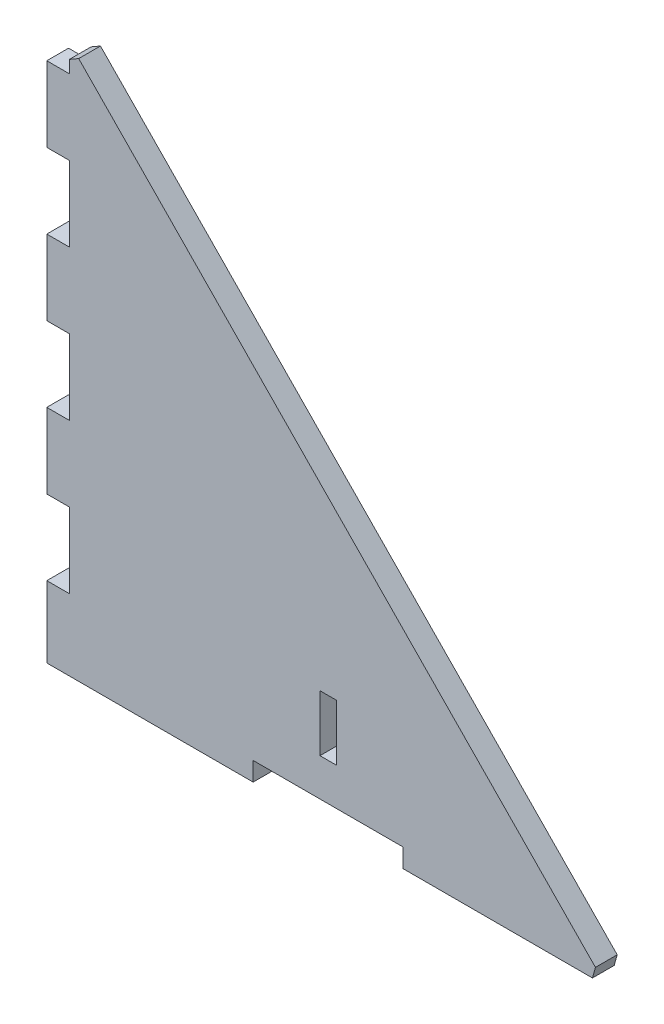
ISO-10303-21;
HEADER;
FILE_DESCRIPTION(('STEP AP214'),'2;1');
FILE_NAME('part.step','',(''),(''),'','','');
FILE_SCHEMA(('AUTOMOTIVE_DESIGN { 1 0 10303 214 1 1 1 1 }'));
ENDSEC;
DATA;
#1=APPLICATION_CONTEXT('core data for automotive mechanical design processes');
#2=APPLICATION_PROTOCOL_DEFINITION('international standard','automotive_design',2000,#1);
#3=PRODUCT_CONTEXT('',#1,'mechanical');
#4=PRODUCT('Part','Part','',(#3));
#5=PRODUCT_RELATED_PRODUCT_CATEGORY('part','',(#4));
#6=PRODUCT_DEFINITION_FORMATION('','',#4);
#7=PRODUCT_DEFINITION_CONTEXT('part definition',#1,'design');
#8=PRODUCT_DEFINITION('design','',#6,#7);
#9=PRODUCT_DEFINITION_SHAPE('','',#8);
#10=(LENGTH_UNIT() NAMED_UNIT(*) SI_UNIT(.MILLI.,.METRE.));
#11=(NAMED_UNIT(*) PLANE_ANGLE_UNIT() SI_UNIT($,.RADIAN.));
#12=(NAMED_UNIT(*) SI_UNIT($,.STERADIAN.) SOLID_ANGLE_UNIT());
#13=UNCERTAINTY_MEASURE_WITH_UNIT(LENGTH_MEASURE(1.E-05),#10,'distance_accuracy_value','');
#14=(GEOMETRIC_REPRESENTATION_CONTEXT(3) GLOBAL_UNCERTAINTY_ASSIGNED_CONTEXT((#13)) GLOBAL_UNIT_ASSIGNED_CONTEXT((#10,
#11,#12)) REPRESENTATION_CONTEXT('',''));
#15=CARTESIAN_POINT('',(0.,0.,0.));
#16=DIRECTION('',(0.,0.,1.));
#17=DIRECTION('',(1.,0.,0.));
#18=AXIS2_PLACEMENT_3D('',#15,#16,#17);
#19=CARTESIAN_POINT('',(0.,0.,144.490770958943));
#20=DIRECTION('',(0.,0.,-1.));
#21=DIRECTION('',(-1.,0.,0.));
#22=AXIS2_PLACEMENT_3D('',#19,#20,#21);
#23=PLANE('',#22);
#24=DIRECTION('',(0.,1.,0.));
#25=VECTOR('',#24,1.);
#26=CARTESIAN_POINT('',(5.99999999999914,69.9999999999999,144.490770958943));
#27=LINE('',#26,#25);
#28=CARTESIAN_POINT('',(5.99999999999914,69.9999999999999,144.490770958943));
#29=VERTEX_POINT('',#28);
#30=CARTESIAN_POINT('',(5.9999999999992,71.6541279702322,144.490770958943));
#31=VERTEX_POINT('',#30);
#32=EDGE_CURVE('E299',#29,#31,#27,.T.);
#33=ORIENTED_EDGE('',*,*,#32,.T.);
#34=DIRECTION('',(-0.866025403784458,-0.499999999999966,0.));
#35=VECTOR('',#34,1.);
#36=CARTESIAN_POINT('',(-29.5271475541201,51.1425197663237,144.490770958943));
#37=LINE('',#36,#35);
#38=CARTESIAN_POINT('',(7.24974671635039,72.3756695733363,144.490770958943));
#39=VERTEX_POINT('',#38);
#40=EDGE_CURVE('E47',#31,#39,#37,.F.);
#41=ORIENTED_EDGE('',*,*,#40,.T.);
#42=DIRECTION('',(0.699031413700107,-0.715090961109445,0.));
#43=VECTOR('',#42,1.);
#44=CARTESIAN_POINT('',(5.99999999999929,73.6541279702322,144.490770958943));
#45=LINE('',#44,#43);
#46=CARTESIAN_POINT('',(76.1131661967949,1.93018192221889,144.490770958943));
#47=VERTEX_POINT('',#46);
#48=EDGE_CURVE('E301',#39,#47,#45,.T.);
#49=ORIENTED_EDGE('',*,*,#48,.T.);
#50=DIRECTION('',(0.269771231487344,0.962924442862368,0.));
#51=VECTOR('',#50,1.);
#52=CARTESIAN_POINT('',(70.0725130059331,-19.6313929583418,144.490770958943));
#53=LINE('',#52,#51);
#54=CARTESIAN_POINT('',(75.7124889253145,0.499999999999995,144.490770958943));
#55=VERTEX_POINT('',#54);
#56=EDGE_CURVE('E54',#47,#55,#53,.F.);
#57=ORIENTED_EDGE('',*,*,#56,.T.);
#58=DIRECTION('',(-1.,0.,0.));
#59=VECTOR('',#58,1.);
#60=CARTESIAN_POINT('',(77.9999999999991,0.499999999999994,144.490770958943));
#61=LINE('',#60,#59);
#62=CARTESIAN_POINT('',(50.4999999999991,0.499999999999998,144.490770958943));
#63=VERTEX_POINT('',#62);
#64=EDGE_CURVE('E266',#55,#63,#61,.T.);
#65=ORIENTED_EDGE('',*,*,#64,.T.);
#66=DIRECTION('',(0.,1.,0.));
#67=VECTOR('',#66,1.);
#68=CARTESIAN_POINT('',(50.4999999999991,0.,144.490770958943));
#69=LINE('',#68,#67);
#70=CARTESIAN_POINT('',(50.4999999999991,3.,144.490770958943));
#71=VERTEX_POINT('',#70);
#72=EDGE_CURVE('E263',#63,#71,#69,.T.);
#73=ORIENTED_EDGE('',*,*,#72,.T.);
#74=DIRECTION('',(-1.,0.,0.));
#75=VECTOR('',#74,1.);
#76=CARTESIAN_POINT('',(30.4999999999991,3.,144.490770958943));
#77=LINE('',#76,#75);
#78=CARTESIAN_POINT('',(30.4999999999991,3.,144.490770958943));
#79=VERTEX_POINT('',#78);
#80=EDGE_CURVE('E265',#71,#79,#77,.T.);
#81=ORIENTED_EDGE('',*,*,#80,.T.);
#82=DIRECTION('',(0.,-1.,0.));
#83=VECTOR('',#82,1.);
#84=CARTESIAN_POINT('',(30.4999999999991,0.,144.490770958943));
#85=LINE('',#84,#83);
#86=CARTESIAN_POINT('',(30.4999999999991,0.5,144.490770958943));
#87=VERTEX_POINT('',#86);
#88=EDGE_CURVE('E268',#79,#87,#85,.T.);
#89=ORIENTED_EDGE('',*,*,#88,.T.);
#90=DIRECTION('',(-1.,0.,0.));
#91=VECTOR('',#90,1.);
#92=CARTESIAN_POINT('',(30.4999999999991,0.5,144.490770958943));
#93=LINE('',#92,#91);
#94=CARTESIAN_POINT('',(2.99999999999913,0.5,144.490770958943));
#95=VERTEX_POINT('',#94);
#96=EDGE_CURVE('E270',#87,#95,#93,.T.);
#97=ORIENTED_EDGE('',*,*,#96,.T.);
#98=DIRECTION('',(0.,1.,0.));
#99=VECTOR('',#98,1.);
#100=CARTESIAN_POINT('',(2.99999999999913,0.,144.490770958943));
#101=LINE('',#100,#99);
#102=CARTESIAN_POINT('',(2.99999999999914,9.99999999999986,144.490770958943));
#103=VERTEX_POINT('',#102);
#104=EDGE_CURVE('E271',#95,#103,#101,.T.);
#105=ORIENTED_EDGE('',*,*,#104,.T.);
#106=DIRECTION('',(1.,0.,0.));
#107=VECTOR('',#106,1.);
#108=CARTESIAN_POINT('',(5.99999999999921,9.99999999999984,144.490770958943));
#109=LINE('',#108,#107);
#110=CARTESIAN_POINT('',(5.99999999999921,9.99999999999984,144.490770958943));
#111=VERTEX_POINT('',#110);
#112=EDGE_CURVE('E273',#103,#111,#109,.T.);
#113=ORIENTED_EDGE('',*,*,#112,.T.);
#114=DIRECTION('',(0.,1.,0.));
#115=VECTOR('',#114,1.);
#116=CARTESIAN_POINT('',(5.99999999999921,9.99999999999984,144.490770958943));
#117=LINE('',#116,#115);
#118=CARTESIAN_POINT('',(5.99999999999928,19.9999999999998,144.490770958943));
#119=VERTEX_POINT('',#118);
#120=EDGE_CURVE('E275',#111,#119,#117,.T.);
#121=ORIENTED_EDGE('',*,*,#120,.T.);
#122=DIRECTION('',(-1.,0.,0.));
#123=VECTOR('',#122,1.);
#124=CARTESIAN_POINT('',(5.99999999999928,19.9999999999998,144.490770958943));
#125=LINE('',#124,#123);
#126=CARTESIAN_POINT('',(2.99999999999914,19.9999999999999,144.490770958943));
#127=VERTEX_POINT('',#126);
#128=EDGE_CURVE('E277',#119,#127,#125,.T.);
#129=ORIENTED_EDGE('',*,*,#128,.T.);
#130=DIRECTION('',(0.,1.,0.));
#131=VECTOR('',#130,1.);
#132=CARTESIAN_POINT('',(2.99999999999914,19.9999999999999,144.490770958943));
#133=LINE('',#132,#131);
#134=CARTESIAN_POINT('',(2.99999999999914,29.9999999999998,144.490770958943));
#135=VERTEX_POINT('',#134);
#136=EDGE_CURVE('E279',#127,#135,#133,.T.);
#137=ORIENTED_EDGE('',*,*,#136,.T.);
#138=DIRECTION('',(1.,0.,0.));
#139=VECTOR('',#138,1.);
#140=CARTESIAN_POINT('',(5.99999999999914,29.9999999999999,144.490770958943));
#141=LINE('',#140,#139);
#142=CARTESIAN_POINT('',(5.99999999999914,29.9999999999999,144.490770958943));
#143=VERTEX_POINT('',#142);
#144=EDGE_CURVE('E281',#135,#143,#141,.T.);
#145=ORIENTED_EDGE('',*,*,#144,.T.);
#146=DIRECTION('',(0.,1.,0.));
#147=VECTOR('',#146,1.);
#148=CARTESIAN_POINT('',(5.99999999999914,29.9999999999999,144.490770958943));
#149=LINE('',#148,#147);
#150=CARTESIAN_POINT('',(5.99999999999914,39.9999999999999,144.490770958943));
#151=VERTEX_POINT('',#150);
#152=EDGE_CURVE('E283',#143,#151,#149,.T.);
#153=ORIENTED_EDGE('',*,*,#152,.T.);
#154=DIRECTION('',(-1.,0.,0.));
#155=VECTOR('',#154,1.);
#156=CARTESIAN_POINT('',(5.99999999999914,39.9999999999999,144.490770958943));
#157=LINE('',#156,#155);
#158=CARTESIAN_POINT('',(2.99999999999914,39.9999999999999,144.490770958943));
#159=VERTEX_POINT('',#158);
#160=EDGE_CURVE('E285',#151,#159,#157,.T.);
#161=ORIENTED_EDGE('',*,*,#160,.T.);
#162=DIRECTION('',(0.,1.,0.));
#163=VECTOR('',#162,1.);
#164=CARTESIAN_POINT('',(2.99999999999914,39.9999999999999,144.490770958943));
#165=LINE('',#164,#163);
#166=CARTESIAN_POINT('',(2.99999999999914,49.9999999999999,144.490770958943));
#167=VERTEX_POINT('',#166);
#168=EDGE_CURVE('E287',#159,#167,#165,.T.);
#169=ORIENTED_EDGE('',*,*,#168,.T.);
#170=DIRECTION('',(1.,0.,0.));
#171=VECTOR('',#170,1.);
#172=CARTESIAN_POINT('',(5.99999999999914,49.9999999999999,144.490770958943));
#173=LINE('',#172,#171);
#174=CARTESIAN_POINT('',(5.99999999999914,49.9999999999999,144.490770958943));
#175=VERTEX_POINT('',#174);
#176=EDGE_CURVE('E289',#167,#175,#173,.T.);
#177=ORIENTED_EDGE('',*,*,#176,.T.);
#178=DIRECTION('',(0.,1.,0.));
#179=VECTOR('',#178,1.);
#180=CARTESIAN_POINT('',(5.99999999999914,49.9999999999999,144.490770958943));
#181=LINE('',#180,#179);
#182=CARTESIAN_POINT('',(5.99999999999914,59.9999999999999,144.490770958943));
#183=VERTEX_POINT('',#182);
#184=EDGE_CURVE('E291',#175,#183,#181,.T.);
#185=ORIENTED_EDGE('',*,*,#184,.T.);
#186=DIRECTION('',(-1.,0.,0.));
#187=VECTOR('',#186,1.);
#188=CARTESIAN_POINT('',(5.99999999999914,59.9999999999999,144.490770958943));
#189=LINE('',#188,#187);
#190=CARTESIAN_POINT('',(2.99999999999914,59.9999999999999,144.490770958943));
#191=VERTEX_POINT('',#190);
#192=EDGE_CURVE('E293',#183,#191,#189,.T.);
#193=ORIENTED_EDGE('',*,*,#192,.T.);
#194=DIRECTION('',(0.,1.,0.));
#195=VECTOR('',#194,1.);
#196=CARTESIAN_POINT('',(2.99999999999914,59.9999999999999,144.490770958943));
#197=LINE('',#196,#195);
#198=CARTESIAN_POINT('',(2.99999999999915,69.9999999999999,144.490770958943));
#199=VERTEX_POINT('',#198);
#200=EDGE_CURVE('E295',#191,#199,#197,.T.);
#201=ORIENTED_EDGE('',*,*,#200,.T.);
#202=DIRECTION('',(1.,0.,0.));
#203=VECTOR('',#202,1.);
#204=CARTESIAN_POINT('',(5.99999999999914,69.9999999999999,144.490770958943));
#205=LINE('',#204,#203);
#206=EDGE_CURVE('E297',#199,#29,#205,.T.);
#207=ORIENTED_EDGE('',*,*,#206,.T.);
#208=EDGE_LOOP('',(#33,#41,#49,#57,#65,#73,#81,#89,#97,#105,#113,#121,#129,#137,#145,#153,#161,
#169,#177,#185,#193,#201,#207));
#209=FACE_BOUND('',#208,.T.);
#210=DIRECTION('',(1.,0.,0.));
#211=VECTOR('',#210,1.);
#212=CARTESIAN_POINT('',(39.3999999999991,15.5,144.490770958943));
#213=LINE('',#212,#211);
#214=CARTESIAN_POINT('',(39.3999999999991,15.5,144.490770958943));
#215=VERTEX_POINT('',#214);
#216=CARTESIAN_POINT('',(41.5999999999991,15.5,144.490770958943));
#217=VERTEX_POINT('',#216);
#218=EDGE_CURVE('E232',#215,#217,#213,.T.);
#219=ORIENTED_EDGE('',*,*,#218,.F.);
#220=DIRECTION('',(0.,1.,0.));
#221=VECTOR('',#220,1.);
#222=CARTESIAN_POINT('',(39.3999999999991,8.,144.490770958943));
#223=LINE('',#222,#221);
#224=CARTESIAN_POINT('',(39.3999999999991,8.,144.490770958943));
#225=VERTEX_POINT('',#224);
#226=EDGE_CURVE('E222',#225,#215,#223,.T.);
#227=ORIENTED_EDGE('',*,*,#226,.F.);
#228=DIRECTION('',(-1.,0.,0.));
#229=VECTOR('',#228,1.);
#230=CARTESIAN_POINT('',(39.3999999999991,8.,144.490770958943));
#231=LINE('',#230,#229);
#232=CARTESIAN_POINT('',(41.5999999999991,8.,144.490770958943));
#233=VERTEX_POINT('',#232);
#234=EDGE_CURVE('E247',#233,#225,#231,.T.);
#235=ORIENTED_EDGE('',*,*,#234,.F.);
#236=DIRECTION('',(0.,-1.,0.));
#237=VECTOR('',#236,1.);
#238=CARTESIAN_POINT('',(41.5999999999991,8.,144.490770958943));
#239=LINE('',#238,#237);
#240=EDGE_CURVE('E245',#217,#233,#239,.T.);
#241=ORIENTED_EDGE('',*,*,#240,.F.);
#242=EDGE_LOOP('',(#219,#227,#235,#241));
#243=FACE_BOUND('',#242,.T.);
#244=ADVANCED_FACE('F38',(#209,#243),#23,.T.);
#245=CARTESIAN_POINT('',(0.,0.,147.390770958943));
#246=DIRECTION('',(0.,0.,-1.));
#247=DIRECTION('',(-1.,0.,0.));
#248=AXIS2_PLACEMENT_3D('',#245,#246,#247);
#249=PLANE('',#248);
#250=DIRECTION('',(0.699031413700107,-0.715090961109445,0.));
#251=VECTOR('',#250,1.);
#252=CARTESIAN_POINT('',(5.99999999999929,73.6541279702322,147.390770958943));
#253=LINE('',#252,#251);
#254=CARTESIAN_POINT('',(7.24974671635039,72.3756695733363,147.390770958943));
#255=VERTEX_POINT('',#254);
#256=CARTESIAN_POINT('',(76.1131661967949,1.93018192221889,147.390770958943));
#257=VERTEX_POINT('',#256);
#258=EDGE_CURVE('E341',#255,#257,#253,.T.);
#259=ORIENTED_EDGE('',*,*,#258,.F.);
#260=DIRECTION('',(0.866025403784458,0.499999999999966,0.));
#261=VECTOR('',#260,1.);
#262=CARTESIAN_POINT('',(7.24974671635039,72.3756695733363,147.390770958943));
#263=LINE('',#262,#261);
#264=CARTESIAN_POINT('',(5.9999999999992,71.6541279702322,147.390770958943));
#265=VERTEX_POINT('',#264);
#266=EDGE_CURVE('E411',#255,#265,#263,.F.);
#267=ORIENTED_EDGE('',*,*,#266,.T.);
#268=DIRECTION('',(0.,1.,0.));
#269=VECTOR('',#268,1.);
#270=CARTESIAN_POINT('',(5.99999999999914,69.9999999999999,147.390770958943));
#271=LINE('',#270,#269);
#272=CARTESIAN_POINT('',(5.99999999999914,69.9999999999999,147.390770958943));
#273=VERTEX_POINT('',#272);
#274=EDGE_CURVE('E339',#273,#265,#271,.T.);
#275=ORIENTED_EDGE('',*,*,#274,.F.);
#276=DIRECTION('',(1.,0.,0.));
#277=VECTOR('',#276,1.);
#278=CARTESIAN_POINT('',(5.99999999999914,69.9999999999999,147.390770958943));
#279=LINE('',#278,#277);
#280=CARTESIAN_POINT('',(2.99999999999914,69.9999999999999,147.390770958943));
#281=VERTEX_POINT('',#280);
#282=EDGE_CURVE('E337',#281,#273,#279,.T.);
#283=ORIENTED_EDGE('',*,*,#282,.F.);
#284=DIRECTION('',(0.,1.,0.));
#285=VECTOR('',#284,1.);
#286=CARTESIAN_POINT('',(2.99999999999914,59.9999999999999,147.390770958943));
#287=LINE('',#286,#285);
#288=CARTESIAN_POINT('',(2.99999999999914,59.9999999999999,147.390770958943));
#289=VERTEX_POINT('',#288);
#290=EDGE_CURVE('E335',#289,#281,#287,.T.);
#291=ORIENTED_EDGE('',*,*,#290,.F.);
#292=DIRECTION('',(-1.,0.,0.));
#293=VECTOR('',#292,1.);
#294=CARTESIAN_POINT('',(5.99999999999914,59.9999999999999,147.390770958943));
#295=LINE('',#294,#293);
#296=CARTESIAN_POINT('',(5.99999999999914,59.9999999999999,147.390770958943));
#297=VERTEX_POINT('',#296);
#298=EDGE_CURVE('E333',#297,#289,#295,.T.);
#299=ORIENTED_EDGE('',*,*,#298,.F.);
#300=DIRECTION('',(0.,1.,0.));
#301=VECTOR('',#300,1.);
#302=CARTESIAN_POINT('',(5.99999999999914,49.9999999999999,147.390770958943));
#303=LINE('',#302,#301);
#304=CARTESIAN_POINT('',(5.99999999999914,49.9999999999999,147.390770958943));
#305=VERTEX_POINT('',#304);
#306=EDGE_CURVE('E331',#305,#297,#303,.T.);
#307=ORIENTED_EDGE('',*,*,#306,.F.);
#308=DIRECTION('',(1.,0.,0.));
#309=VECTOR('',#308,1.);
#310=CARTESIAN_POINT('',(5.99999999999914,49.9999999999999,147.390770958943));
#311=LINE('',#310,#309);
#312=CARTESIAN_POINT('',(2.99999999999914,49.9999999999999,147.390770958943));
#313=VERTEX_POINT('',#312);
#314=EDGE_CURVE('E329',#313,#305,#311,.T.);
#315=ORIENTED_EDGE('',*,*,#314,.F.);
#316=DIRECTION('',(0.,1.,0.));
#317=VECTOR('',#316,1.);
#318=CARTESIAN_POINT('',(2.99999999999914,39.9999999999999,147.390770958943));
#319=LINE('',#318,#317);
#320=CARTESIAN_POINT('',(2.99999999999914,39.9999999999999,147.390770958943));
#321=VERTEX_POINT('',#320);
#322=EDGE_CURVE('E327',#321,#313,#319,.T.);
#323=ORIENTED_EDGE('',*,*,#322,.F.);
#324=DIRECTION('',(-1.,0.,0.));
#325=VECTOR('',#324,1.);
#326=CARTESIAN_POINT('',(5.99999999999914,39.9999999999999,147.390770958943));
#327=LINE('',#326,#325);
#328=CARTESIAN_POINT('',(5.99999999999914,39.9999999999999,147.390770958943));
#329=VERTEX_POINT('',#328);
#330=EDGE_CURVE('E325',#329,#321,#327,.T.);
#331=ORIENTED_EDGE('',*,*,#330,.F.);
#332=DIRECTION('',(0.,1.,0.));
#333=VECTOR('',#332,1.);
#334=CARTESIAN_POINT('',(5.99999999999914,29.9999999999999,147.390770958943));
#335=LINE('',#334,#333);
#336=CARTESIAN_POINT('',(5.99999999999914,29.9999999999999,147.390770958943));
#337=VERTEX_POINT('',#336);
#338=EDGE_CURVE('E323',#337,#329,#335,.T.);
#339=ORIENTED_EDGE('',*,*,#338,.F.);
#340=DIRECTION('',(1.,0.,0.));
#341=VECTOR('',#340,1.);
#342=CARTESIAN_POINT('',(5.99999999999914,29.9999999999999,147.390770958943));
#343=LINE('',#342,#341);
#344=CARTESIAN_POINT('',(2.99999999999914,29.9999999999998,147.390770958943));
#345=VERTEX_POINT('',#344);
#346=EDGE_CURVE('E321',#345,#337,#343,.T.);
#347=ORIENTED_EDGE('',*,*,#346,.F.);
#348=DIRECTION('',(0.,1.,0.));
#349=VECTOR('',#348,1.);
#350=CARTESIAN_POINT('',(2.99999999999914,19.9999999999999,147.390770958943));
#351=LINE('',#350,#349);
#352=CARTESIAN_POINT('',(2.99999999999914,19.9999999999999,147.390770958943));
#353=VERTEX_POINT('',#352);
#354=EDGE_CURVE('E319',#353,#345,#351,.T.);
#355=ORIENTED_EDGE('',*,*,#354,.F.);
#356=DIRECTION('',(-1.,0.,0.));
#357=VECTOR('',#356,1.);
#358=CARTESIAN_POINT('',(5.99999999999928,19.9999999999998,147.390770958943));
#359=LINE('',#358,#357);
#360=CARTESIAN_POINT('',(5.99999999999928,19.9999999999998,147.390770958943));
#361=VERTEX_POINT('',#360);
#362=EDGE_CURVE('E317',#361,#353,#359,.T.);
#363=ORIENTED_EDGE('',*,*,#362,.F.);
#364=DIRECTION('',(0.,1.,0.));
#365=VECTOR('',#364,1.);
#366=CARTESIAN_POINT('',(5.99999999999921,9.99999999999984,147.390770958943));
#367=LINE('',#366,#365);
#368=CARTESIAN_POINT('',(5.99999999999921,9.99999999999984,147.390770958943));
#369=VERTEX_POINT('',#368);
#370=EDGE_CURVE('E315',#369,#361,#367,.T.);
#371=ORIENTED_EDGE('',*,*,#370,.F.);
#372=DIRECTION('',(1.,0.,0.));
#373=VECTOR('',#372,1.);
#374=CARTESIAN_POINT('',(5.99999999999921,9.99999999999984,147.390770958943));
#375=LINE('',#374,#373);
#376=CARTESIAN_POINT('',(2.99999999999914,9.99999999999986,147.390770958943));
#377=VERTEX_POINT('',#376);
#378=EDGE_CURVE('E313',#377,#369,#375,.T.);
#379=ORIENTED_EDGE('',*,*,#378,.F.);
#380=DIRECTION('',(0.,1.,0.));
#381=VECTOR('',#380,1.);
#382=CARTESIAN_POINT('',(2.99999999999913,0.,147.390770958943));
#383=LINE('',#382,#381);
#384=CARTESIAN_POINT('',(2.99999999999913,0.5,147.390770958943));
#385=VERTEX_POINT('',#384);
#386=EDGE_CURVE('E311',#385,#377,#383,.T.);
#387=ORIENTED_EDGE('',*,*,#386,.F.);
#388=DIRECTION('',(-1.,0.,0.));
#389=VECTOR('',#388,1.);
#390=CARTESIAN_POINT('',(30.4999999999991,0.5,147.390770958943));
#391=LINE('',#390,#389);
#392=CARTESIAN_POINT('',(30.4999999999991,0.5,147.390770958943));
#393=VERTEX_POINT('',#392);
#394=EDGE_CURVE('E310',#393,#385,#391,.T.);
#395=ORIENTED_EDGE('',*,*,#394,.F.);
#396=DIRECTION('',(0.,-1.,0.));
#397=VECTOR('',#396,1.);
#398=CARTESIAN_POINT('',(30.4999999999991,0.,147.390770958943));
#399=LINE('',#398,#397);
#400=CARTESIAN_POINT('',(30.4999999999991,3.,147.390770958943));
#401=VERTEX_POINT('',#400);
#402=EDGE_CURVE('E308',#401,#393,#399,.T.);
#403=ORIENTED_EDGE('',*,*,#402,.F.);
#404=DIRECTION('',(-1.,0.,0.));
#405=VECTOR('',#404,1.);
#406=CARTESIAN_POINT('',(30.4999999999991,3.,147.390770958943));
#407=LINE('',#406,#405);
#408=CARTESIAN_POINT('',(50.4999999999991,3.,147.390770958943));
#409=VERTEX_POINT('',#408);
#410=EDGE_CURVE('E306',#409,#401,#407,.T.);
#411=ORIENTED_EDGE('',*,*,#410,.F.);
#412=DIRECTION('',(0.,1.,0.));
#413=VECTOR('',#412,1.);
#414=CARTESIAN_POINT('',(50.4999999999991,0.,147.390770958943));
#415=LINE('',#414,#413);
#416=CARTESIAN_POINT('',(50.4999999999991,0.499999999999998,147.390770958943));
#417=VERTEX_POINT('',#416);
#418=EDGE_CURVE('E304',#417,#409,#415,.T.);
#419=ORIENTED_EDGE('',*,*,#418,.F.);
#420=DIRECTION('',(-1.,0.,0.));
#421=VECTOR('',#420,1.);
#422=CARTESIAN_POINT('',(77.9999999999991,0.499999999999994,147.390770958943));
#423=LINE('',#422,#421);
#424=CARTESIAN_POINT('',(75.7124889253145,0.499999999999995,147.390770958943));
#425=VERTEX_POINT('',#424);
#426=EDGE_CURVE('E240',#425,#417,#423,.T.);
#427=ORIENTED_EDGE('',*,*,#426,.F.);
#428=DIRECTION('',(-0.269771231487344,-0.962924442862368,0.));
#429=VECTOR('',#428,1.);
#430=CARTESIAN_POINT('',(75.7124889253145,0.499999999999995,147.390770958943));
#431=LINE('',#430,#429);
#432=EDGE_CURVE('E409',#425,#257,#431,.F.);
#433=ORIENTED_EDGE('',*,*,#432,.T.);
#434=EDGE_LOOP('',(#259,#267,#275,#283,#291,#299,#307,#315,#323,#331,#339,#347,#355,#363,#371,
#379,#387,#395,#403,#411,#419,#427,#433));
#435=FACE_BOUND('',#434,.T.);
#436=DIRECTION('',(0.,1.,0.));
#437=VECTOR('',#436,1.);
#438=CARTESIAN_POINT('',(39.3999999999991,8.,147.390770958943));
#439=LINE('',#438,#437);
#440=CARTESIAN_POINT('',(39.3999999999991,8.,147.390770958943));
#441=VERTEX_POINT('',#440);
#442=CARTESIAN_POINT('',(39.3999999999991,15.5,147.390770958943));
#443=VERTEX_POINT('',#442);
#444=EDGE_CURVE('E251',#441,#443,#439,.T.);
#445=ORIENTED_EDGE('',*,*,#444,.T.);
#446=DIRECTION('',(1.,0.,0.));
#447=VECTOR('',#446,1.);
#448=CARTESIAN_POINT('',(39.3999999999991,15.5,147.390770958943));
#449=LINE('',#448,#447);
#450=CARTESIAN_POINT('',(41.5999999999991,15.5,147.390770958943));
#451=VERTEX_POINT('',#450);
#452=EDGE_CURVE('E239',#443,#451,#449,.T.);
#453=ORIENTED_EDGE('',*,*,#452,.T.);
#454=DIRECTION('',(0.,-1.,0.));
#455=VECTOR('',#454,1.);
#456=CARTESIAN_POINT('',(41.5999999999991,8.,147.390770958943));
#457=LINE('',#456,#455);
#458=CARTESIAN_POINT('',(41.5999999999991,8.,147.390770958943));
#459=VERTEX_POINT('',#458);
#460=EDGE_CURVE('E254',#451,#459,#457,.T.);
#461=ORIENTED_EDGE('',*,*,#460,.T.);
#462=DIRECTION('',(-1.,0.,0.));
#463=VECTOR('',#462,1.);
#464=CARTESIAN_POINT('',(39.3999999999991,8.,147.390770958943));
#465=LINE('',#464,#463);
#466=EDGE_CURVE('E233',#459,#441,#465,.T.);
#467=ORIENTED_EDGE('',*,*,#466,.T.);
#468=EDGE_LOOP('',(#445,#453,#461,#467));
#469=FACE_BOUND('',#468,.T.);
#470=ADVANCED_FACE('F425',(#435,#469),#249,.F.);
#471=CARTESIAN_POINT('',(77.9999999999991,0.499999999999994,144.490770958943));
#472=DIRECTION('',(0.,1.,0.));
#473=DIRECTION('',(-1.,0.,0.));
#474=AXIS2_PLACEMENT_3D('',#471,#472,#473);
#475=PLANE('',#474);
#476=ORIENTED_EDGE('',*,*,#64,.F.);
#477=DIRECTION('',(0.,0.,1.));
#478=VECTOR('',#477,1.);
#479=CARTESIAN_POINT('',(75.7124889253145,0.499999999999995,144.490770958943));
#480=LINE('',#479,#478);
#481=EDGE_CURVE('E12',#55,#425,#480,.T.);
#482=ORIENTED_EDGE('',*,*,#481,.T.);
#483=ORIENTED_EDGE('',*,*,#426,.T.);
#484=DIRECTION('',(0.,0.,1.));
#485=VECTOR('',#484,1.);
#486=CARTESIAN_POINT('',(50.4999999999991,0.499999999999998,144.490770958943));
#487=LINE('',#486,#485);
#488=EDGE_CURVE('E393',#63,#417,#487,.T.);
#489=ORIENTED_EDGE('',*,*,#488,.F.);
#490=EDGE_LOOP('',(#476,#482,#483,#489));
#491=FACE_BOUND('',#490,.T.);
#492=ADVANCED_FACE('F521',(#491),#475,.F.);
#493=CARTESIAN_POINT('',(50.4999999999991,0.,144.490770958943));
#494=DIRECTION('',(1.,0.,0.));
#495=DIRECTION('',(0.,0.,-1.));
#496=AXIS2_PLACEMENT_3D('',#493,#494,#495);
#497=PLANE('',#496);
#498=ORIENTED_EDGE('',*,*,#418,.T.);
#499=DIRECTION('',(0.,0.,1.));
#500=VECTOR('',#499,1.);
#501=CARTESIAN_POINT('',(50.4999999999991,3.,144.490770958943));
#502=LINE('',#501,#500);
#503=EDGE_CURVE('E389',#71,#409,#502,.T.);
#504=ORIENTED_EDGE('',*,*,#503,.F.);
#505=ORIENTED_EDGE('',*,*,#72,.F.);
#506=ORIENTED_EDGE('',*,*,#488,.T.);
#507=EDGE_LOOP('',(#498,#504,#505,#506));
#508=FACE_BOUND('',#507,.T.);
#509=ADVANCED_FACE('F518',(#508),#497,.F.);
#510=CARTESIAN_POINT('',(30.4999999999991,3.,144.490770958943));
#511=DIRECTION('',(0.,1.,0.));
#512=DIRECTION('',(-1.,0.,0.));
#513=AXIS2_PLACEMENT_3D('',#510,#511,#512);
#514=PLANE('',#513);
#515=ORIENTED_EDGE('',*,*,#410,.T.);
#516=DIRECTION('',(0.,0.,1.));
#517=VECTOR('',#516,1.);
#518=CARTESIAN_POINT('',(30.4999999999991,3.,144.490770958943));
#519=LINE('',#518,#517);
#520=EDGE_CURVE('E386',#79,#401,#519,.T.);
#521=ORIENTED_EDGE('',*,*,#520,.F.);
#522=ORIENTED_EDGE('',*,*,#80,.F.);
#523=ORIENTED_EDGE('',*,*,#503,.T.);
#524=EDGE_LOOP('',(#515,#521,#522,#523));
#525=FACE_BOUND('',#524,.T.);
#526=ADVANCED_FACE('F513',(#525),#514,.F.);
#527=CARTESIAN_POINT('',(30.4999999999991,0.,144.490770958943));
#528=DIRECTION('',(-1.,0.,0.));
#529=DIRECTION('',(0.,-1.,0.));
#530=AXIS2_PLACEMENT_3D('',#527,#528,#529);
#531=PLANE('',#530);
#532=ORIENTED_EDGE('',*,*,#402,.T.);
#533=DIRECTION('',(0.,0.,1.));
#534=VECTOR('',#533,1.);
#535=CARTESIAN_POINT('',(30.4999999999991,0.5,144.490770958943));
#536=LINE('',#535,#534);
#537=EDGE_CURVE('E390',#87,#393,#536,.T.);
#538=ORIENTED_EDGE('',*,*,#537,.F.);
#539=ORIENTED_EDGE('',*,*,#88,.F.);
#540=ORIENTED_EDGE('',*,*,#520,.T.);
#541=EDGE_LOOP('',(#532,#538,#539,#540));
#542=FACE_BOUND('',#541,.T.);
#543=ADVANCED_FACE('F507',(#542),#531,.F.);
#544=CARTESIAN_POINT('',(30.4999999999991,0.5,144.490770958943));
#545=DIRECTION('',(0.,1.,0.));
#546=DIRECTION('',(-1.,0.,0.));
#547=AXIS2_PLACEMENT_3D('',#544,#545,#546);
#548=PLANE('',#547);
#549=ORIENTED_EDGE('',*,*,#394,.T.);
#550=DIRECTION('',(0.,0.,1.));
#551=VECTOR('',#550,1.);
#552=CARTESIAN_POINT('',(2.99999999999913,0.5,144.490770958943));
#553=LINE('',#552,#551);
#554=EDGE_CURVE('E385',#95,#385,#553,.T.);
#555=ORIENTED_EDGE('',*,*,#554,.F.);
#556=ORIENTED_EDGE('',*,*,#96,.F.);
#557=ORIENTED_EDGE('',*,*,#537,.T.);
#558=EDGE_LOOP('',(#549,#555,#556,#557));
#559=FACE_BOUND('',#558,.T.);
#560=ADVANCED_FACE('F503',(#559),#548,.F.);
#561=CARTESIAN_POINT('',(2.99999999999913,0.,144.490770958943));
#562=DIRECTION('',(1.,0.,0.));
#563=DIRECTION('',(0.,1.,0.));
#564=AXIS2_PLACEMENT_3D('',#561,#562,#563);
#565=PLANE('',#564);
#566=ORIENTED_EDGE('',*,*,#386,.T.);
#567=DIRECTION('',(0.,0.,1.));
#568=VECTOR('',#567,1.);
#569=CARTESIAN_POINT('',(2.99999999999914,9.99999999999986,144.490770958943));
#570=LINE('',#569,#568);
#571=EDGE_CURVE('E382',#103,#377,#570,.T.);
#572=ORIENTED_EDGE('',*,*,#571,.F.);
#573=ORIENTED_EDGE('',*,*,#104,.F.);
#574=ORIENTED_EDGE('',*,*,#554,.T.);
#575=EDGE_LOOP('',(#566,#572,#573,#574));
#576=FACE_BOUND('',#575,.T.);
#577=ADVANCED_FACE('F498',(#576),#565,.F.);
#578=CARTESIAN_POINT('',(5.99999999999921,9.99999999999984,144.490770958943));
#579=DIRECTION('',(0.,-1.,0.));
#580=DIRECTION('',(1.,0.,0.));
#581=AXIS2_PLACEMENT_3D('',#578,#579,#580);
#582=PLANE('',#581);
#583=ORIENTED_EDGE('',*,*,#378,.T.);
#584=DIRECTION('',(0.,0.,1.));
#585=VECTOR('',#584,1.);
#586=CARTESIAN_POINT('',(5.99999999999921,9.99999999999984,144.490770958943));
#587=LINE('',#586,#585);
#588=EDGE_CURVE('E379',#111,#369,#587,.T.);
#589=ORIENTED_EDGE('',*,*,#588,.F.);
#590=ORIENTED_EDGE('',*,*,#112,.F.);
#591=ORIENTED_EDGE('',*,*,#571,.T.);
#592=EDGE_LOOP('',(#583,#589,#590,#591));
#593=FACE_BOUND('',#592,.T.);
#594=ADVANCED_FACE('F492',(#593),#582,.F.);
#595=CARTESIAN_POINT('',(5.99999999999921,9.99999999999984,144.490770958943));
#596=DIRECTION('',(1.,0.,0.));
#597=DIRECTION('',(0.,1.,0.));
#598=AXIS2_PLACEMENT_3D('',#595,#596,#597);
#599=PLANE('',#598);
#600=ORIENTED_EDGE('',*,*,#370,.T.);
#601=DIRECTION('',(0.,0.,1.));
#602=VECTOR('',#601,1.);
#603=CARTESIAN_POINT('',(5.99999999999928,19.9999999999998,144.490770958943));
#604=LINE('',#603,#602);
#605=EDGE_CURVE('E376',#119,#361,#604,.T.);
#606=ORIENTED_EDGE('',*,*,#605,.F.);
#607=ORIENTED_EDGE('',*,*,#120,.F.);
#608=ORIENTED_EDGE('',*,*,#588,.T.);
#609=EDGE_LOOP('',(#600,#606,#607,#608));
#610=FACE_BOUND('',#609,.T.);
#611=ADVANCED_FACE('F488',(#610),#599,.F.);
#612=CARTESIAN_POINT('',(5.99999999999928,19.9999999999998,144.490770958943));
#613=DIRECTION('',(0.,1.,0.));
#614=DIRECTION('',(-1.,0.,0.));
#615=AXIS2_PLACEMENT_3D('',#612,#613,#614);
#616=PLANE('',#615);
#617=ORIENTED_EDGE('',*,*,#362,.T.);
#618=DIRECTION('',(0.,0.,1.));
#619=VECTOR('',#618,1.);
#620=CARTESIAN_POINT('',(2.99999999999914,19.9999999999999,144.490770958943));
#621=LINE('',#620,#619);
#622=EDGE_CURVE('E373',#127,#353,#621,.T.);
#623=ORIENTED_EDGE('',*,*,#622,.F.);
#624=ORIENTED_EDGE('',*,*,#128,.F.);
#625=ORIENTED_EDGE('',*,*,#605,.T.);
#626=EDGE_LOOP('',(#617,#623,#624,#625));
#627=FACE_BOUND('',#626,.T.);
#628=ADVANCED_FACE('F483',(#627),#616,.F.);
#629=CARTESIAN_POINT('',(2.99999999999914,19.9999999999999,144.490770958943));
#630=DIRECTION('',(1.,0.,0.));
#631=DIRECTION('',(0.,1.,0.));
#632=AXIS2_PLACEMENT_3D('',#629,#630,#631);
#633=PLANE('',#632);
#634=ORIENTED_EDGE('',*,*,#354,.T.);
#635=DIRECTION('',(0.,0.,1.));
#636=VECTOR('',#635,1.);
#637=CARTESIAN_POINT('',(2.99999999999914,29.9999999999998,144.490770958943));
#638=LINE('',#637,#636);
#639=EDGE_CURVE('E370',#135,#345,#638,.T.);
#640=ORIENTED_EDGE('',*,*,#639,.F.);
#641=ORIENTED_EDGE('',*,*,#136,.F.);
#642=ORIENTED_EDGE('',*,*,#622,.T.);
#643=EDGE_LOOP('',(#634,#640,#641,#642));
#644=FACE_BOUND('',#643,.T.);
#645=ADVANCED_FACE('F477',(#644),#633,.F.);
#646=CARTESIAN_POINT('',(5.99999999999914,29.9999999999999,144.490770958943));
#647=DIRECTION('',(0.,-1.,0.));
#648=DIRECTION('',(1.,0.,0.));
#649=AXIS2_PLACEMENT_3D('',#646,#647,#648);
#650=PLANE('',#649);
#651=ORIENTED_EDGE('',*,*,#346,.T.);
#652=DIRECTION('',(0.,0.,1.));
#653=VECTOR('',#652,1.);
#654=CARTESIAN_POINT('',(5.99999999999914,29.9999999999999,144.490770958943));
#655=LINE('',#654,#653);
#656=EDGE_CURVE('E367',#143,#337,#655,.T.);
#657=ORIENTED_EDGE('',*,*,#656,.F.);
#658=ORIENTED_EDGE('',*,*,#144,.F.);
#659=ORIENTED_EDGE('',*,*,#639,.T.);
#660=EDGE_LOOP('',(#651,#657,#658,#659));
#661=FACE_BOUND('',#660,.T.);
#662=ADVANCED_FACE('F473',(#661),#650,.F.);
#663=CARTESIAN_POINT('',(5.99999999999914,29.9999999999999,144.490770958943));
#664=DIRECTION('',(1.,0.,0.));
#665=DIRECTION('',(0.,0.,-1.));
#666=AXIS2_PLACEMENT_3D('',#663,#664,#665);
#667=PLANE('',#666);
#668=ORIENTED_EDGE('',*,*,#338,.T.);
#669=DIRECTION('',(0.,0.,1.));
#670=VECTOR('',#669,1.);
#671=CARTESIAN_POINT('',(5.99999999999914,39.9999999999999,144.490770958943));
#672=LINE('',#671,#670);
#673=EDGE_CURVE('E364',#151,#329,#672,.T.);
#674=ORIENTED_EDGE('',*,*,#673,.F.);
#675=ORIENTED_EDGE('',*,*,#152,.F.);
#676=ORIENTED_EDGE('',*,*,#656,.T.);
#677=EDGE_LOOP('',(#668,#674,#675,#676));
#678=FACE_BOUND('',#677,.T.);
#679=ADVANCED_FACE('F468',(#678),#667,.F.);
#680=CARTESIAN_POINT('',(5.99999999999914,39.9999999999999,144.490770958943));
#681=DIRECTION('',(0.,1.,0.));
#682=DIRECTION('',(-1.,0.,0.));
#683=AXIS2_PLACEMENT_3D('',#680,#681,#682);
#684=PLANE('',#683);
#685=ORIENTED_EDGE('',*,*,#330,.T.);
#686=DIRECTION('',(0.,0.,1.));
#687=VECTOR('',#686,1.);
#688=CARTESIAN_POINT('',(2.99999999999914,39.9999999999999,144.490770958943));
#689=LINE('',#688,#687);
#690=EDGE_CURVE('E361',#159,#321,#689,.T.);
#691=ORIENTED_EDGE('',*,*,#690,.F.);
#692=ORIENTED_EDGE('',*,*,#160,.F.);
#693=ORIENTED_EDGE('',*,*,#673,.T.);
#694=EDGE_LOOP('',(#685,#691,#692,#693));
#695=FACE_BOUND('',#694,.T.);
#696=ADVANCED_FACE('F462',(#695),#684,.F.);
#697=CARTESIAN_POINT('',(2.99999999999914,39.9999999999999,144.490770958943));
#698=DIRECTION('',(1.,0.,0.));
#699=DIRECTION('',(0.,1.,0.));
#700=AXIS2_PLACEMENT_3D('',#697,#698,#699);
#701=PLANE('',#700);
#702=ORIENTED_EDGE('',*,*,#322,.T.);
#703=DIRECTION('',(0.,0.,1.));
#704=VECTOR('',#703,1.);
#705=CARTESIAN_POINT('',(2.99999999999914,49.9999999999999,144.490770958943));
#706=LINE('',#705,#704);
#707=EDGE_CURVE('E358',#167,#313,#706,.T.);
#708=ORIENTED_EDGE('',*,*,#707,.F.);
#709=ORIENTED_EDGE('',*,*,#168,.F.);
#710=ORIENTED_EDGE('',*,*,#690,.T.);
#711=EDGE_LOOP('',(#702,#708,#709,#710));
#712=FACE_BOUND('',#711,.T.);
#713=ADVANCED_FACE('F458',(#712),#701,.F.);
#714=CARTESIAN_POINT('',(5.99999999999914,49.9999999999999,144.490770958943));
#715=DIRECTION('',(0.,-1.,0.));
#716=DIRECTION('',(1.,0.,0.));
#717=AXIS2_PLACEMENT_3D('',#714,#715,#716);
#718=PLANE('',#717);
#719=ORIENTED_EDGE('',*,*,#314,.T.);
#720=DIRECTION('',(0.,0.,1.));
#721=VECTOR('',#720,1.);
#722=CARTESIAN_POINT('',(5.99999999999914,49.9999999999999,144.490770958943));
#723=LINE('',#722,#721);
#724=EDGE_CURVE('E355',#175,#305,#723,.T.);
#725=ORIENTED_EDGE('',*,*,#724,.F.);
#726=ORIENTED_EDGE('',*,*,#176,.F.);
#727=ORIENTED_EDGE('',*,*,#707,.T.);
#728=EDGE_LOOP('',(#719,#725,#726,#727));
#729=FACE_BOUND('',#728,.T.);
#730=ADVANCED_FACE('F453',(#729),#718,.F.);
#731=CARTESIAN_POINT('',(5.99999999999914,49.9999999999999,144.490770958943));
#732=DIRECTION('',(1.,0.,0.));
#733=DIRECTION('',(0.,0.,-1.));
#734=AXIS2_PLACEMENT_3D('',#731,#732,#733);
#735=PLANE('',#734);
#736=ORIENTED_EDGE('',*,*,#306,.T.);
#737=DIRECTION('',(0.,0.,1.));
#738=VECTOR('',#737,1.);
#739=CARTESIAN_POINT('',(5.99999999999914,59.9999999999999,144.490770958943));
#740=LINE('',#739,#738);
#741=EDGE_CURVE('E352',#183,#297,#740,.T.);
#742=ORIENTED_EDGE('',*,*,#741,.F.);
#743=ORIENTED_EDGE('',*,*,#184,.F.);
#744=ORIENTED_EDGE('',*,*,#724,.T.);
#745=EDGE_LOOP('',(#736,#742,#743,#744));
#746=FACE_BOUND('',#745,.T.);
#747=ADVANCED_FACE('F447',(#746),#735,.F.);
#748=CARTESIAN_POINT('',(5.99999999999914,59.9999999999999,144.490770958943));
#749=DIRECTION('',(0.,1.,0.));
#750=DIRECTION('',(-1.,0.,0.));
#751=AXIS2_PLACEMENT_3D('',#748,#749,#750);
#752=PLANE('',#751);
#753=ORIENTED_EDGE('',*,*,#298,.T.);
#754=DIRECTION('',(0.,0.,1.));
#755=VECTOR('',#754,1.);
#756=CARTESIAN_POINT('',(2.99999999999914,59.9999999999999,144.490770958943));
#757=LINE('',#756,#755);
#758=EDGE_CURVE('E349',#191,#289,#757,.T.);
#759=ORIENTED_EDGE('',*,*,#758,.F.);
#760=ORIENTED_EDGE('',*,*,#192,.F.);
#761=ORIENTED_EDGE('',*,*,#741,.T.);
#762=EDGE_LOOP('',(#753,#759,#760,#761));
#763=FACE_BOUND('',#762,.T.);
#764=ADVANCED_FACE('F443',(#763),#752,.F.);
#765=CARTESIAN_POINT('',(2.99999999999914,59.9999999999999,144.490770958943));
#766=DIRECTION('',(1.,0.,0.));
#767=DIRECTION('',(0.,1.,0.));
#768=AXIS2_PLACEMENT_3D('',#765,#766,#767);
#769=PLANE('',#768);
#770=ORIENTED_EDGE('',*,*,#290,.T.);
#771=DIRECTION('',(0.,0.,1.));
#772=VECTOR('',#771,1.);
#773=CARTESIAN_POINT('',(2.99999999999915,69.9999999999999,144.490770958943));
#774=LINE('',#773,#772);
#775=EDGE_CURVE('E346',#199,#281,#774,.T.);
#776=ORIENTED_EDGE('',*,*,#775,.F.);
#777=ORIENTED_EDGE('',*,*,#200,.F.);
#778=ORIENTED_EDGE('',*,*,#758,.T.);
#779=EDGE_LOOP('',(#770,#776,#777,#778));
#780=FACE_BOUND('',#779,.T.);
#781=ADVANCED_FACE('F438',(#780),#769,.F.);
#782=CARTESIAN_POINT('',(5.99999999999914,69.9999999999999,144.490770958943));
#783=DIRECTION('',(0.,-1.,0.));
#784=DIRECTION('',(1.,0.,0.));
#785=AXIS2_PLACEMENT_3D('',#782,#783,#784);
#786=PLANE('',#785);
#787=ORIENTED_EDGE('',*,*,#282,.T.);
#788=DIRECTION('',(0.,0.,1.));
#789=VECTOR('',#788,1.);
#790=CARTESIAN_POINT('',(5.99999999999914,69.9999999999999,144.490770958943));
#791=LINE('',#790,#789);
#792=EDGE_CURVE('E303',#29,#273,#791,.T.);
#793=ORIENTED_EDGE('',*,*,#792,.F.);
#794=ORIENTED_EDGE('',*,*,#206,.F.);
#795=ORIENTED_EDGE('',*,*,#775,.T.);
#796=EDGE_LOOP('',(#787,#793,#794,#795));
#797=FACE_BOUND('',#796,.T.);
#798=ADVANCED_FACE('F432',(#797),#786,.F.);
#799=CARTESIAN_POINT('',(5.99999999999914,69.9999999999999,144.490770958943));
#800=DIRECTION('',(1.,0.,0.));
#801=DIRECTION('',(0.,1.,0.));
#802=AXIS2_PLACEMENT_3D('',#799,#800,#801);
#803=PLANE('',#802);
#804=ORIENTED_EDGE('',*,*,#274,.T.);
#805=DIRECTION('',(0.,0.,-1.));
#806=VECTOR('',#805,1.);
#807=CARTESIAN_POINT('',(5.9999999999992,71.6541279702322,144.490770958943));
#808=LINE('',#807,#806);
#809=EDGE_CURVE('E62',#265,#31,#808,.T.);
#810=ORIENTED_EDGE('',*,*,#809,.T.);
#811=ORIENTED_EDGE('',*,*,#32,.F.);
#812=ORIENTED_EDGE('',*,*,#792,.T.);
#813=EDGE_LOOP('',(#804,#810,#811,#812));
#814=FACE_BOUND('',#813,.T.);
#815=ADVANCED_FACE('F428',(#814),#803,.F.);
#816=CARTESIAN_POINT('',(5.99999999999929,73.6541279702322,144.490770958943));
#817=DIRECTION('',(-0.715090961109445,-0.699031413700107,0.));
#818=DIRECTION('',(0.699031413700107,-0.715090961109445,0.));
#819=AXIS2_PLACEMENT_3D('',#816,#817,#818);
#820=PLANE('',#819);
#821=ORIENTED_EDGE('',*,*,#48,.F.);
#822=DIRECTION('',(0.,0.,1.));
#823=VECTOR('',#822,1.);
#824=CARTESIAN_POINT('',(7.24974671635039,72.3756695733363,144.490770958943));
#825=LINE('',#824,#823);
#826=EDGE_CURVE('E406',#39,#255,#825,.T.);
#827=ORIENTED_EDGE('',*,*,#826,.T.);
#828=ORIENTED_EDGE('',*,*,#258,.T.);
#829=DIRECTION('',(0.,0.,-1.));
#830=VECTOR('',#829,1.);
#831=CARTESIAN_POINT('',(76.1131661967949,1.93018192221889,144.490770958943));
#832=LINE('',#831,#830);
#833=EDGE_CURVE('E404',#257,#47,#832,.T.);
#834=ORIENTED_EDGE('',*,*,#833,.T.);
#835=EDGE_LOOP('',(#821,#827,#828,#834));
#836=FACE_BOUND('',#835,.T.);
#837=ADVANCED_FACE('F419',(#836),#820,.F.);
#838=CARTESIAN_POINT('',(39.3999999999991,8.,144.490770958943));
#839=DIRECTION('',(1.,0.,0.));
#840=DIRECTION('',(0.,0.,-1.));
#841=AXIS2_PLACEMENT_3D('',#838,#839,#840);
#842=PLANE('',#841);
#843=ORIENTED_EDGE('',*,*,#444,.F.);
#844=DIRECTION('',(0.,0.,1.));
#845=VECTOR('',#844,1.);
#846=CARTESIAN_POINT('',(39.3999999999991,8.,144.490770958943));
#847=LINE('',#846,#845);
#848=EDGE_CURVE('E228',#225,#441,#847,.T.);
#849=ORIENTED_EDGE('',*,*,#848,.F.);
#850=ORIENTED_EDGE('',*,*,#226,.T.);
#851=DIRECTION('',(0.,0.,1.));
#852=VECTOR('',#851,1.);
#853=CARTESIAN_POINT('',(39.3999999999991,15.5,144.490770958943));
#854=LINE('',#853,#852);
#855=EDGE_CURVE('E225',#215,#443,#854,.T.);
#856=ORIENTED_EDGE('',*,*,#855,.T.);
#857=EDGE_LOOP('',(#843,#849,#850,#856));
#858=FACE_BOUND('',#857,.T.);
#859=ADVANCED_FACE('F224',(#858),#842,.T.);
#860=CARTESIAN_POINT('',(39.3999999999991,15.5,144.490770958943));
#861=DIRECTION('',(0.,-1.,0.));
#862=DIRECTION('',(0.,0.,-1.));
#863=AXIS2_PLACEMENT_3D('',#860,#861,#862);
#864=PLANE('',#863);
#865=ORIENTED_EDGE('',*,*,#452,.F.);
#866=ORIENTED_EDGE('',*,*,#855,.F.);
#867=ORIENTED_EDGE('',*,*,#218,.T.);
#868=DIRECTION('',(0.,0.,1.));
#869=VECTOR('',#868,1.);
#870=CARTESIAN_POINT('',(41.5999999999991,15.5,144.490770958943));
#871=LINE('',#870,#869);
#872=EDGE_CURVE('E241',#217,#451,#871,.T.);
#873=ORIENTED_EDGE('',*,*,#872,.T.);
#874=EDGE_LOOP('',(#865,#866,#867,#873));
#875=FACE_BOUND('',#874,.T.);
#876=ADVANCED_FACE('F236',(#875),#864,.T.);
#877=CARTESIAN_POINT('',(41.5999999999991,8.,144.490770958943));
#878=DIRECTION('',(-1.,0.,0.));
#879=DIRECTION('',(0.,-1.,0.));
#880=AXIS2_PLACEMENT_3D('',#877,#878,#879);
#881=PLANE('',#880);
#882=ORIENTED_EDGE('',*,*,#460,.F.);
#883=ORIENTED_EDGE('',*,*,#872,.F.);
#884=ORIENTED_EDGE('',*,*,#240,.T.);
#885=DIRECTION('',(0.,0.,1.));
#886=VECTOR('',#885,1.);
#887=CARTESIAN_POINT('',(41.5999999999991,8.,144.490770958943));
#888=LINE('',#887,#886);
#889=EDGE_CURVE('E260',#233,#459,#888,.T.);
#890=ORIENTED_EDGE('',*,*,#889,.T.);
#891=EDGE_LOOP('',(#882,#883,#884,#890));
#892=FACE_BOUND('',#891,.T.);
#893=ADVANCED_FACE('F681',(#892),#881,.T.);
#894=CARTESIAN_POINT('',(39.3999999999991,8.,144.490770958943));
#895=DIRECTION('',(0.,1.,0.));
#896=DIRECTION('',(0.,0.,1.));
#897=AXIS2_PLACEMENT_3D('',#894,#895,#896);
#898=PLANE('',#897);
#899=ORIENTED_EDGE('',*,*,#466,.F.);
#900=ORIENTED_EDGE('',*,*,#889,.F.);
#901=ORIENTED_EDGE('',*,*,#234,.T.);
#902=ORIENTED_EDGE('',*,*,#848,.T.);
#903=EDGE_LOOP('',(#899,#900,#901,#902));
#904=FACE_BOUND('',#903,.T.);
#905=ADVANCED_FACE('F528',(#904),#898,.T.);
#906=CARTESIAN_POINT('',(7.24974671635039,72.3756695733363,144.490770958943));
#907=DIRECTION('',(0.499999999999966,-0.866025403784458,0.));
#908=DIRECTION('',(0.,0.,1.));
#909=AXIS2_PLACEMENT_3D('',#906,#907,#908);
#910=PLANE('',#909);
#911=ORIENTED_EDGE('',*,*,#40,.F.);
#912=ORIENTED_EDGE('',*,*,#809,.F.);
#913=ORIENTED_EDGE('',*,*,#266,.F.);
#914=ORIENTED_EDGE('',*,*,#826,.F.);
#915=EDGE_LOOP('',(#911,#912,#913,#914));
#916=FACE_BOUND('',#915,.T.);
#917=ADVANCED_FACE('F422',(#916),#910,.F.);
#918=CARTESIAN_POINT('',(75.7124889253145,0.499999999999995,144.490770958943));
#919=DIRECTION('',(-0.962924442862368,0.269771231487344,0.));
#920=DIRECTION('',(0.,0.,1.));
#921=AXIS2_PLACEMENT_3D('',#918,#919,#920);
#922=PLANE('',#921);
#923=ORIENTED_EDGE('',*,*,#56,.F.);
#924=ORIENTED_EDGE('',*,*,#833,.F.);
#925=ORIENTED_EDGE('',*,*,#432,.F.);
#926=ORIENTED_EDGE('',*,*,#481,.F.);
#927=EDGE_LOOP('',(#923,#924,#925,#926));
#928=FACE_BOUND('',#927,.T.);
#929=ADVANCED_FACE('F41',(#928),#922,.F.);
#930=CLOSED_SHELL('',(#244,#470,#492,#509,#526,#543,#560,#577,#594,#611,#628,#645,#662,#679,
#696,#713,#730,#747,#764,#781,#798,#815,#837,#859,#876,#893,#905,#917,#929));
#931=MANIFOLD_SOLID_BREP('B2',#930);
#932=ADVANCED_BREP_SHAPE_REPRESENTATION('',(#18,#931),#14);
#933=SHAPE_DEFINITION_REPRESENTATION(#9,#932);
ENDSEC;
END-ISO-10303-21;
